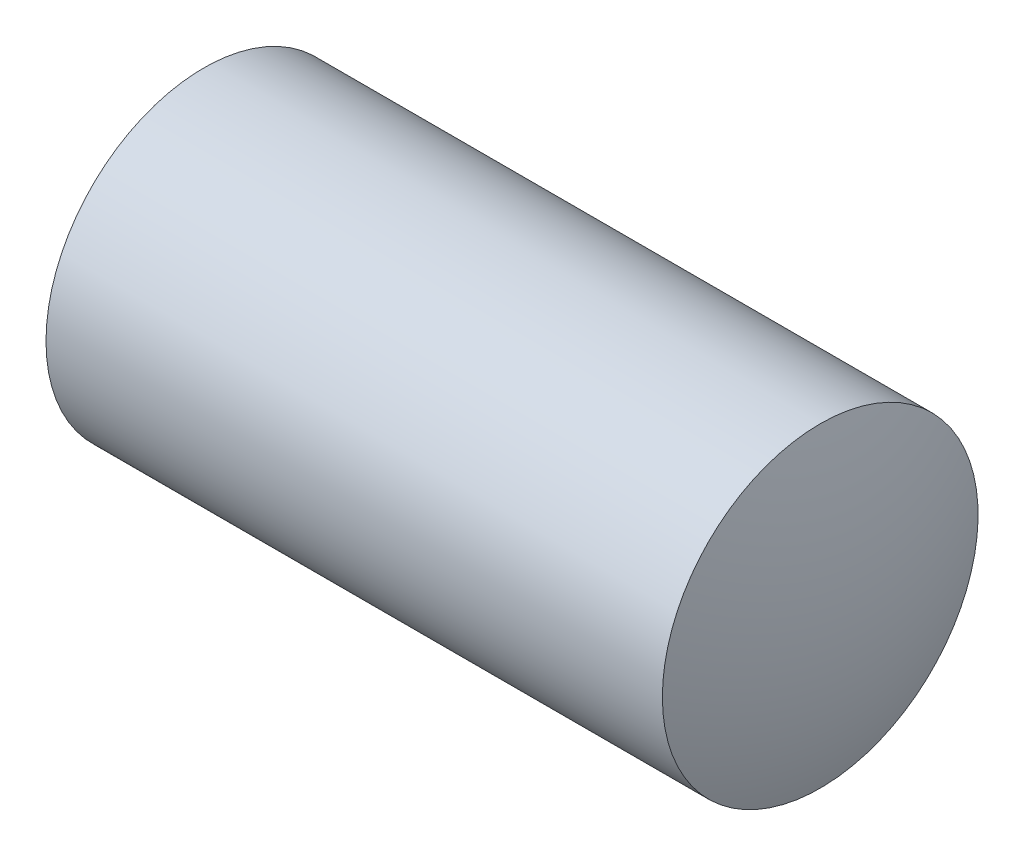
ISO-10303-21;
HEADER;
FILE_DESCRIPTION(('STEP AP214'),'2;1');
FILE_NAME('part.step','',(''),(''),'','','');
FILE_SCHEMA(('AUTOMOTIVE_DESIGN { 1 0 10303 214 1 1 1 1 }'));
ENDSEC;
DATA;
#1=APPLICATION_CONTEXT('core data for automotive mechanical design processes');
#2=APPLICATION_PROTOCOL_DEFINITION('international standard','automotive_design',2000,#1);
#3=PRODUCT_CONTEXT('',#1,'mechanical');
#4=PRODUCT('Part','Part','',(#3));
#5=PRODUCT_RELATED_PRODUCT_CATEGORY('part','',(#4));
#6=PRODUCT_DEFINITION_FORMATION('','',#4);
#7=PRODUCT_DEFINITION_CONTEXT('part definition',#1,'design');
#8=PRODUCT_DEFINITION('design','',#6,#7);
#9=PRODUCT_DEFINITION_SHAPE('','',#8);
#10=(LENGTH_UNIT() NAMED_UNIT(*) SI_UNIT(.MILLI.,.METRE.));
#11=(NAMED_UNIT(*) PLANE_ANGLE_UNIT() SI_UNIT($,.RADIAN.));
#12=(NAMED_UNIT(*) SI_UNIT($,.STERADIAN.) SOLID_ANGLE_UNIT());
#13=UNCERTAINTY_MEASURE_WITH_UNIT(LENGTH_MEASURE(1.E-05),#10,'distance_accuracy_value','');
#14=(GEOMETRIC_REPRESENTATION_CONTEXT(3) GLOBAL_UNCERTAINTY_ASSIGNED_CONTEXT((#13)) GLOBAL_UNIT_ASSIGNED_CONTEXT((#10,
#11,#12)) REPRESENTATION_CONTEXT('',''));
#15=CARTESIAN_POINT('',(0.,0.,0.));
#16=DIRECTION('',(0.,0.,1.));
#17=DIRECTION('',(1.,0.,0.));
#18=AXIS2_PLACEMENT_3D('',#15,#16,#17);
#19=CARTESIAN_POINT('',(0.,0.,0.));
#20=DIRECTION('',(-1.,0.,0.));
#21=DIRECTION('',(0.,0.,1.));
#22=AXIS2_PLACEMENT_3D('',#19,#20,#21);
#23=PLANE('',#22);
#24=CARTESIAN_POINT('',(0.,0.,0.));
#25=DIRECTION('',(-1.,0.,0.));
#26=DIRECTION('',(0.,0.,1.));
#27=AXIS2_PLACEMENT_3D('',#24,#25,#26);
#28=CIRCLE('',#27,10.352);
#29=CARTESIAN_POINT('',(0.,0.,10.352));
#30=VERTEX_POINT('',#29);
#31=EDGE_CURVE('E136',#30,#30,#28,.T.);
#32=ORIENTED_EDGE('',*,*,#31,.T.);
#33=EDGE_LOOP('',(#32));
#34=FACE_BOUND('',#33,.T.);
#35=DIRECTION('',(0.,0.,-1.));
#36=VECTOR('',#35,1.);
#37=CARTESIAN_POINT('',(0.,6.,3.46410161513775));
#38=LINE('',#37,#36);
#39=CARTESIAN_POINT('',(0.,6.,3.46410161513775));
#40=VERTEX_POINT('',#39);
#41=CARTESIAN_POINT('',(0.,6.,-3.46410161513776));
#42=VERTEX_POINT('',#41);
#43=EDGE_CURVE('E127',#40,#42,#38,.T.);
#44=ORIENTED_EDGE('',*,*,#43,.F.);
#45=DIRECTION('',(0.,-0.866025403784439,0.5));
#46=VECTOR('',#45,1.);
#47=CARTESIAN_POINT('',(0.,6.,3.46410161513775));
#48=LINE('',#47,#46);
#49=CARTESIAN_POINT('',(0.,0.,6.9282032302755));
#50=VERTEX_POINT('',#49);
#51=EDGE_CURVE('E49',#40,#50,#48,.T.);
#52=ORIENTED_EDGE('',*,*,#51,.T.);
#53=DIRECTION('',(0.,0.866025403784439,0.5));
#54=VECTOR('',#53,1.);
#55=CARTESIAN_POINT('',(0.,-5.99999999999999,3.46410161513775));
#56=LINE('',#55,#54);
#57=CARTESIAN_POINT('',(0.,-5.99999999999999,3.46410161513775));
#58=VERTEX_POINT('',#57);
#59=EDGE_CURVE('E118',#58,#50,#56,.T.);
#60=ORIENTED_EDGE('',*,*,#59,.F.);
#61=DIRECTION('',(0.,0.,-1.));
#62=VECTOR('',#61,1.);
#63=CARTESIAN_POINT('',(0.,-5.99999999999999,3.46410161513775));
#64=LINE('',#63,#62);
#65=CARTESIAN_POINT('',(0.,-5.99999999999999,-3.46410161513775));
#66=VERTEX_POINT('',#65);
#67=EDGE_CURVE('E121',#58,#66,#64,.T.);
#68=ORIENTED_EDGE('',*,*,#67,.T.);
#69=DIRECTION('',(0.,0.866025403784438,-0.5));
#70=VECTOR('',#69,1.);
#71=CARTESIAN_POINT('',(0.,-5.99999999999999,-3.46410161513775));
#72=LINE('',#71,#70);
#73=CARTESIAN_POINT('',(0.,0.,-6.92820323027551));
#74=VERTEX_POINT('',#73);
#75=EDGE_CURVE('E124',#66,#74,#72,.T.);
#76=ORIENTED_EDGE('',*,*,#75,.T.);
#77=DIRECTION('',(0.,-0.866025403784439,-0.5));
#78=VECTOR('',#77,1.);
#79=CARTESIAN_POINT('',(0.,6.,-3.46410161513776));
#80=LINE('',#79,#78);
#81=EDGE_CURVE('E107',#42,#74,#80,.T.);
#82=ORIENTED_EDGE('',*,*,#81,.F.);
#83=EDGE_LOOP('',(#44,#52,#60,#68,#76,#82));
#84=FACE_BOUND('',#83,.T.);
#85=ADVANCED_FACE('F34',(#34,#84),#23,.T.);
#86=CARTESIAN_POINT('',(16.,0.,0.));
#87=DIRECTION('',(-1.,0.,0.));
#88=DIRECTION('',(0.,1.,0.));
#89=AXIS2_PLACEMENT_3D('',#86,#87,#88);
#90=SPHERICAL_SURFACE('',#89,34.);
#91=CARTESIAN_POINT('',(47.8119474411737,0.,0.));
#92=DIRECTION('',(-1.,0.,0.));
#93=DIRECTION('',(0.,0.,1.));
#94=AXIS2_PLACEMENT_3D('',#91,#92,#93);
#95=CIRCLE('',#94,12.);
#96=CARTESIAN_POINT('',(47.8119474411737,0.,12.));
#97=VERTEX_POINT('',#96);
#98=EDGE_CURVE('E11',#97,#97,#95,.T.);
#99=ORIENTED_EDGE('',*,*,#98,.F.);
#100=EDGE_LOOP('',(#99));
#101=FACE_BOUND('',#100,.T.);
#102=ADVANCED_FACE('F36',(#101),#90,.T.);
#103=CARTESIAN_POINT('',(-12.7,0.,0.));
#104=DIRECTION('',(-1.,0.,0.));
#105=DIRECTION('',(0.,0.,1.));
#106=AXIS2_PLACEMENT_3D('',#103,#104,#105);
#107=CYLINDRICAL_SURFACE('',#106,12.);
#108=ORIENTED_EDGE('',*,*,#98,.T.);
#109=EDGE_LOOP('',(#108));
#110=FACE_BOUND('',#109,.T.);
#111=CARTESIAN_POINT('',(0.951473243624499,0.,0.));
#112=DIRECTION('',(-1.,0.,0.));
#113=DIRECTION('',(0.,0.,1.));
#114=AXIS2_PLACEMENT_3D('',#111,#112,#113);
#115=CIRCLE('',#114,12.);
#116=CARTESIAN_POINT('',(0.951473243624499,0.,12.));
#117=VERTEX_POINT('',#116);
#118=EDGE_CURVE('E42',#117,#117,#115,.T.);
#119=ORIENTED_EDGE('',*,*,#118,.F.);
#120=EDGE_LOOP('',(#119));
#121=FACE_BOUND('',#120,.T.);
#122=ADVANCED_FACE('F144',(#110,#121),#107,.T.);
#123=CARTESIAN_POINT('',(0.,0.,0.));
#124=DIRECTION('',(1.,0.,0.));
#125=DIRECTION('',(0.,0.,-1.));
#126=AXIS2_PLACEMENT_3D('',#123,#124,#125);
#127=CONICAL_SURFACE('',#126,10.352,1.0471975511966);
#128=ORIENTED_EDGE('',*,*,#118,.T.);
#129=EDGE_LOOP('',(#128));
#130=FACE_BOUND('',#129,.T.);
#131=ORIENTED_EDGE('',*,*,#31,.F.);
#132=EDGE_LOOP('',(#131));
#133=FACE_BOUND('',#132,.T.);
#134=ADVANCED_FACE('F141',(#130,#133),#127,.T.);
#135=CARTESIAN_POINT('',(15.,6.,3.46410161513775));
#136=DIRECTION('',(0.,-0.5,-0.866025403784439));
#137=DIRECTION('',(0.,0.866025403784439,-0.5));
#138=AXIS2_PLACEMENT_3D('',#135,#136,#137);
#139=PLANE('',#138);
#140=ORIENTED_EDGE('',*,*,#51,.F.);
#141=DIRECTION('',(-1.,0.,0.));
#142=VECTOR('',#141,1.);
#143=CARTESIAN_POINT('',(15.,6.,3.46410161513775));
#144=LINE('',#143,#142);
#145=CARTESIAN_POINT('',(15.,6.,3.46410161513775));
#146=VERTEX_POINT('',#145);
#147=EDGE_CURVE('E54',#146,#40,#144,.T.);
#148=ORIENTED_EDGE('',*,*,#147,.F.);
#149=DIRECTION('',(0.,-0.866025403784439,0.5));
#150=VECTOR('',#149,1.);
#151=CARTESIAN_POINT('',(15.,6.,3.46410161513775));
#152=LINE('',#151,#150);
#153=CARTESIAN_POINT('',(15.,0.,6.9282032302755));
#154=VERTEX_POINT('',#153);
#155=EDGE_CURVE('E81',#146,#154,#152,.T.);
#156=ORIENTED_EDGE('',*,*,#155,.T.);
#157=DIRECTION('',(-1.,0.,0.));
#158=VECTOR('',#157,1.);
#159=CARTESIAN_POINT('',(15.,0.,6.9282032302755));
#160=LINE('',#159,#158);
#161=EDGE_CURVE('E134',#154,#50,#160,.T.);
#162=ORIENTED_EDGE('',*,*,#161,.T.);
#163=EDGE_LOOP('',(#140,#148,#156,#162));
#164=FACE_BOUND('',#163,.T.);
#165=ADVANCED_FACE('F151',(#164),#139,.T.);
#166=CARTESIAN_POINT('',(15.,-5.99999999999999,3.46410161513775));
#167=DIRECTION('',(0.,-0.5,0.866025403784439));
#168=DIRECTION('',(0.,-0.866025403784439,-0.5));
#169=AXIS2_PLACEMENT_3D('',#166,#167,#168);
#170=PLANE('',#169);
#171=ORIENTED_EDGE('',*,*,#59,.T.);
#172=ORIENTED_EDGE('',*,*,#161,.F.);
#173=DIRECTION('',(0.,0.866025403784439,0.5));
#174=VECTOR('',#173,1.);
#175=CARTESIAN_POINT('',(15.,-5.99999999999999,3.46410161513775));
#176=LINE('',#175,#174);
#177=CARTESIAN_POINT('',(15.,-5.99999999999999,3.46410161513775));
#178=VERTEX_POINT('',#177);
#179=EDGE_CURVE('E249',#178,#154,#176,.T.);
#180=ORIENTED_EDGE('',*,*,#179,.F.);
#181=DIRECTION('',(-1.,0.,0.));
#182=VECTOR('',#181,1.);
#183=CARTESIAN_POINT('',(15.,-5.99999999999999,3.46410161513775));
#184=LINE('',#183,#182);
#185=EDGE_CURVE('E132',#178,#58,#184,.T.);
#186=ORIENTED_EDGE('',*,*,#185,.T.);
#187=EDGE_LOOP('',(#171,#172,#180,#186));
#188=FACE_BOUND('',#187,.T.);
#189=ADVANCED_FACE('F163',(#188),#170,.F.);
#190=CARTESIAN_POINT('',(15.,-5.99999999999999,3.46410161513775));
#191=DIRECTION('',(0.,1.,0.));
#192=DIRECTION('',(0.,0.,1.));
#193=AXIS2_PLACEMENT_3D('',#190,#191,#192);
#194=PLANE('',#193);
#195=ORIENTED_EDGE('',*,*,#67,.F.);
#196=ORIENTED_EDGE('',*,*,#185,.F.);
#197=DIRECTION('',(0.,0.,-1.));
#198=VECTOR('',#197,1.);
#199=CARTESIAN_POINT('',(15.,-5.99999999999999,3.46410161513775));
#200=LINE('',#199,#198);
#201=CARTESIAN_POINT('',(15.,-5.99999999999999,-3.46410161513775));
#202=VERTEX_POINT('',#201);
#203=EDGE_CURVE('E102',#178,#202,#200,.T.);
#204=ORIENTED_EDGE('',*,*,#203,.T.);
#205=DIRECTION('',(-1.,0.,0.));
#206=VECTOR('',#205,1.);
#207=CARTESIAN_POINT('',(15.,-5.99999999999999,-3.46410161513775));
#208=LINE('',#207,#206);
#209=EDGE_CURVE('E97',#202,#66,#208,.T.);
#210=ORIENTED_EDGE('',*,*,#209,.T.);
#211=EDGE_LOOP('',(#195,#196,#204,#210));
#212=FACE_BOUND('',#211,.T.);
#213=ADVANCED_FACE('F166',(#212),#194,.T.);
#214=CARTESIAN_POINT('',(15.,-5.99999999999999,-3.46410161513775));
#215=DIRECTION('',(0.,0.5,0.866025403784438));
#216=DIRECTION('',(0.,-0.866025403784438,0.5));
#217=AXIS2_PLACEMENT_3D('',#214,#215,#216);
#218=PLANE('',#217);
#219=ORIENTED_EDGE('',*,*,#75,.F.);
#220=ORIENTED_EDGE('',*,*,#209,.F.);
#221=DIRECTION('',(0.,0.866025403784438,-0.5));
#222=VECTOR('',#221,1.);
#223=CARTESIAN_POINT('',(15.,-5.99999999999999,-3.46410161513775));
#224=LINE('',#223,#222);
#225=CARTESIAN_POINT('',(15.,0.,-6.92820323027551));
#226=VERTEX_POINT('',#225);
#227=EDGE_CURVE('E92',#202,#226,#224,.T.);
#228=ORIENTED_EDGE('',*,*,#227,.T.);
#229=DIRECTION('',(-1.,0.,0.));
#230=VECTOR('',#229,1.);
#231=CARTESIAN_POINT('',(15.,0.,-6.92820323027551));
#232=LINE('',#231,#230);
#233=EDGE_CURVE('E96',#226,#74,#232,.T.);
#234=ORIENTED_EDGE('',*,*,#233,.T.);
#235=EDGE_LOOP('',(#219,#220,#228,#234));
#236=FACE_BOUND('',#235,.T.);
#237=ADVANCED_FACE('F95',(#236),#218,.T.);
#238=CARTESIAN_POINT('',(15.,6.,-3.46410161513776));
#239=DIRECTION('',(0.,0.5,-0.866025403784438));
#240=DIRECTION('',(0.,0.866025403784439,0.5));
#241=AXIS2_PLACEMENT_3D('',#238,#239,#240);
#242=PLANE('',#241);
#243=ORIENTED_EDGE('',*,*,#81,.T.);
#244=ORIENTED_EDGE('',*,*,#233,.F.);
#245=DIRECTION('',(0.,-0.866025403784439,-0.5));
#246=VECTOR('',#245,1.);
#247=CARTESIAN_POINT('',(15.,6.,-3.46410161513776));
#248=LINE('',#247,#246);
#249=CARTESIAN_POINT('',(15.,6.,-3.46410161513776));
#250=VERTEX_POINT('',#249);
#251=EDGE_CURVE('E101',#250,#226,#248,.T.);
#252=ORIENTED_EDGE('',*,*,#251,.F.);
#253=DIRECTION('',(-1.,0.,0.));
#254=VECTOR('',#253,1.);
#255=CARTESIAN_POINT('',(15.,6.,-3.46410161513776));
#256=LINE('',#255,#254);
#257=EDGE_CURVE('E77',#250,#42,#256,.T.);
#258=ORIENTED_EDGE('',*,*,#257,.T.);
#259=EDGE_LOOP('',(#243,#244,#252,#258));
#260=FACE_BOUND('',#259,.T.);
#261=ADVANCED_FACE('F104',(#260),#242,.F.);
#262=CARTESIAN_POINT('',(15.,6.,3.46410161513775));
#263=DIRECTION('',(0.,1.,0.));
#264=DIRECTION('',(0.,0.,1.));
#265=AXIS2_PLACEMENT_3D('',#262,#263,#264);
#266=PLANE('',#265);
#267=ORIENTED_EDGE('',*,*,#43,.T.);
#268=ORIENTED_EDGE('',*,*,#257,.F.);
#269=DIRECTION('',(0.,0.,-1.));
#270=VECTOR('',#269,1.);
#271=CARTESIAN_POINT('',(15.,6.,3.46410161513775));
#272=LINE('',#271,#270);
#273=EDGE_CURVE('E112',#146,#250,#272,.T.);
#274=ORIENTED_EDGE('',*,*,#273,.F.);
#275=ORIENTED_EDGE('',*,*,#147,.T.);
#276=EDGE_LOOP('',(#267,#268,#274,#275));
#277=FACE_BOUND('',#276,.T.);
#278=ADVANCED_FACE('F175',(#277),#266,.F.);
#279=CARTESIAN_POINT('',(15.,12.,0.));
#280=DIRECTION('',(1.,0.,0.));
#281=DIRECTION('',(0.,0.,-1.));
#282=AXIS2_PLACEMENT_3D('',#279,#280,#281);
#283=PLANE('',#282);
#284=ORIENTED_EDGE('',*,*,#155,.F.);
#285=ORIENTED_EDGE('',*,*,#273,.T.);
#286=ORIENTED_EDGE('',*,*,#251,.T.);
#287=ORIENTED_EDGE('',*,*,#227,.F.);
#288=ORIENTED_EDGE('',*,*,#203,.F.);
#289=ORIENTED_EDGE('',*,*,#179,.T.);
#290=EDGE_LOOP('',(#284,#285,#286,#287,#288,#289));
#291=FACE_BOUND('',#290,.T.);
#292=ADVANCED_FACE('F110',(#291),#283,.F.);
#293=CLOSED_SHELL('',(#85,#102,#122,#134,#165,#189,#213,#237,#261,#278,#292));
#294=MANIFOLD_SOLID_BREP('B2',#293);
#295=ADVANCED_BREP_SHAPE_REPRESENTATION('',(#18,#294),#14);
#296=SHAPE_DEFINITION_REPRESENTATION(#9,#295);
ENDSEC;
END-ISO-10303-21;
